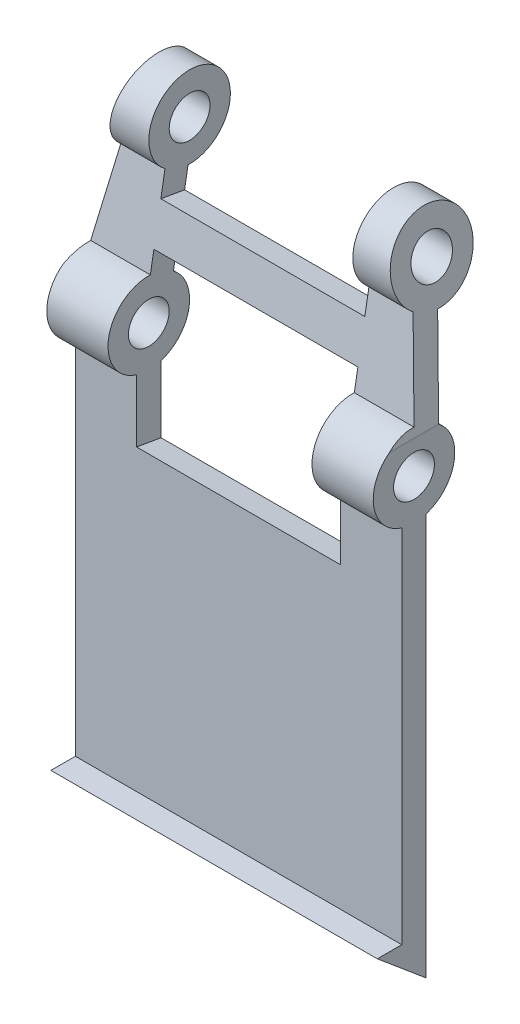
ISO-10303-21;
HEADER;
FILE_DESCRIPTION(('STEP AP214'),'2;1');
FILE_NAME('part.step','',(''),(''),'','','');
FILE_SCHEMA(('AUTOMOTIVE_DESIGN { 1 0 10303 214 1 1 1 1 }'));
ENDSEC;
DATA;
#1=APPLICATION_CONTEXT('core data for automotive mechanical design processes');
#2=APPLICATION_PROTOCOL_DEFINITION('international standard','automotive_design',2000,#1);
#3=PRODUCT_CONTEXT('',#1,'mechanical');
#4=PRODUCT('Part','Part','',(#3));
#5=PRODUCT_RELATED_PRODUCT_CATEGORY('part','',(#4));
#6=PRODUCT_DEFINITION_FORMATION('','',#4);
#7=PRODUCT_DEFINITION_CONTEXT('part definition',#1,'design');
#8=PRODUCT_DEFINITION('design','',#6,#7);
#9=PRODUCT_DEFINITION_SHAPE('','',#8);
#10=(LENGTH_UNIT() NAMED_UNIT(*) SI_UNIT(.MILLI.,.METRE.));
#11=(NAMED_UNIT(*) PLANE_ANGLE_UNIT() SI_UNIT($,.RADIAN.));
#12=(NAMED_UNIT(*) SI_UNIT($,.STERADIAN.) SOLID_ANGLE_UNIT());
#13=UNCERTAINTY_MEASURE_WITH_UNIT(LENGTH_MEASURE(1.E-05),#10,'distance_accuracy_value','');
#14=(GEOMETRIC_REPRESENTATION_CONTEXT(3) GLOBAL_UNCERTAINTY_ASSIGNED_CONTEXT((#13)) GLOBAL_UNIT_ASSIGNED_CONTEXT((#10,
#11,#12)) REPRESENTATION_CONTEXT('',''));
#15=CARTESIAN_POINT('',(0.,0.,0.));
#16=DIRECTION('',(0.,0.,1.));
#17=DIRECTION('',(1.,0.,0.));
#18=AXIS2_PLACEMENT_3D('',#15,#16,#17);
#19=CARTESIAN_POINT('',(-20.,19.3649167310371,-5.));
#20=DIRECTION('',(1.,0.,0.));
#21=DIRECTION('',(0.,0.,-1.));
#22=AXIS2_PLACEMENT_3D('',#19,#20,#21);
#23=CYLINDRICAL_SURFACE('',#22,5.);
#24=CARTESIAN_POINT('',(17.1701886456949,19.3649167310371,-5.));
#25=DIRECTION('',(-0.983483452738319,-0.180998061287722,0.));
#26=DIRECTION('',(0.180998061287722,-0.983483452738319,0.));
#27=AXIS2_PLACEMENT_3D('',#24,#25,#26);
#28=ELLIPSE('',#27,5.08396962458135,5.);
#29=CARTESIAN_POINT('',(17.9042525915353,15.3762566379427,-1.98493936018594));
#30=VERTEX_POINT('',#29);
#31=CARTESIAN_POINT('',(18.0897169639658,14.3685047313189,-4.81061380971055));
#32=VERTEX_POINT('',#31);
#33=EDGE_CURVE('E402',#30,#32,#28,.T.);
#34=ORIENTED_EDGE('',*,*,#33,.T.);
#35=DIRECTION('',(1.,0.,0.));
#36=VECTOR('',#35,1.);
#37=CARTESIAN_POINT('',(-20.,14.3685047313189,-4.81061380971055));
#38=LINE('',#37,#36);
#39=CARTESIAN_POINT('',(12.5,14.3685047313189,-4.81061380971055));
#40=VERTEX_POINT('',#39);
#41=EDGE_CURVE('E240',#40,#32,#38,.T.);
#42=ORIENTED_EDGE('',*,*,#41,.F.);
#43=CARTESIAN_POINT('',(12.5,19.3649167310371,-5.));
#44=DIRECTION('',(1.,0.,0.));
#45=DIRECTION('',(0.,1.,0.));
#46=AXIS2_PLACEMENT_3D('',#43,#44,#45);
#47=CIRCLE('',#46,5.);
#48=CARTESIAN_POINT('',(12.5,15.3762566379427,-1.98493936018594));
#49=VERTEX_POINT('',#48);
#50=EDGE_CURVE('E314',#40,#49,#47,.T.);
#51=ORIENTED_EDGE('',*,*,#50,.T.);
#52=DIRECTION('',(1.,0.,0.));
#53=VECTOR('',#52,1.);
#54=CARTESIAN_POINT('',(-20.,15.3762566379427,-1.98493936018594));
#55=LINE('',#54,#53);
#56=EDGE_CURVE('E243',#49,#30,#55,.T.);
#57=ORIENTED_EDGE('',*,*,#56,.T.);
#58=EDGE_LOOP('',(#34,#42,#51,#57));
#59=FACE_BOUND('',#58,.T.);
#60=ADVANCED_FACE('F33',(#59),#23,.T.);
#61=CARTESIAN_POINT('',(-20.,19.3649167310371,-5.));
#62=DIRECTION('',(1.,0.,0.));
#63=DIRECTION('',(0.,0.,-1.));
#64=AXIS2_PLACEMENT_3D('',#61,#62,#63);
#65=CYLINDRICAL_SURFACE('',#64,2.5);
#66=CARTESIAN_POINT('',(17.1701886456949,19.3649167310371,-5.));
#67=DIRECTION('',(-0.983483452738319,-0.180998061287722,0.));
#68=DIRECTION('',(0.180998061287722,-0.983483452738319,0.));
#69=AXIS2_PLACEMENT_3D('',#66,#67,#68);
#70=ELLIPSE('',#69,2.54198481229067,2.5);
#71=CARTESIAN_POINT('',(17.6302829685423,16.8649167310371,-5.));
#72=VERTEX_POINT('',#71);
#73=EDGE_CURVE('E303',#72,#72,#70,.T.);
#74=ORIENTED_EDGE('',*,*,#73,.F.);
#75=EDGE_LOOP('',(#74));
#76=FACE_BOUND('',#75,.T.);
#77=CARTESIAN_POINT('',(12.5,19.3649167310371,-5.));
#78=DIRECTION('',(1.,0.,0.));
#79=DIRECTION('',(0.,1.,0.));
#80=AXIS2_PLACEMENT_3D('',#77,#78,#79);
#81=CIRCLE('',#80,2.5);
#82=CARTESIAN_POINT('',(12.5,21.8649167310371,-5.));
#83=VERTEX_POINT('',#82);
#84=EDGE_CURVE('E281',#83,#83,#81,.T.);
#85=ORIENTED_EDGE('',*,*,#84,.F.);
#86=EDGE_LOOP('',(#85));
#87=FACE_BOUND('',#86,.T.);
#88=ADVANCED_FACE('F417',(#76,#87),#65,.F.);
#89=CARTESIAN_POINT('',(-20.,0.,0.));
#90=DIRECTION('',(1.,0.,0.));
#91=DIRECTION('',(0.,0.,-1.));
#92=AXIS2_PLACEMENT_3D('',#89,#90,#91);
#93=CYLINDRICAL_SURFACE('',#92,5.);
#94=CARTESIAN_POINT('',(20.,0.,0.));
#95=DIRECTION('',(-1.,0.,0.));
#96=DIRECTION('',(0.,0.,1.));
#97=AXIS2_PLACEMENT_3D('',#94,#95,#96);
#98=CIRCLE('',#97,5.);
#99=CARTESIAN_POINT('',(20.,-4.76969600708473,1.49999999999999));
#100=VERTEX_POINT('',#99);
#101=CARTESIAN_POINT('',(20.,3.98866009309443,3.01506063981406));
#102=VERTEX_POINT('',#101);
#103=EDGE_CURVE('E226',#100,#102,#98,.T.);
#104=ORIENTED_EDGE('',*,*,#103,.T.);
#105=CARTESIAN_POINT('',(20.7340639458404,0.,0.));
#106=DIRECTION('',(-0.983483452738319,-0.180998061287722,0.));
#107=DIRECTION('',(0.180998061287722,-0.983483452738319,0.));
#108=AXIS2_PLACEMENT_3D('',#105,#106,#107);
#109=ELLIPSE('',#108,5.08396962458135,5.);
#110=CARTESIAN_POINT('',(19.8145356275695,4.99641199971816,-0.189386190289448));
#111=VERTEX_POINT('',#110);
#112=EDGE_CURVE('E406',#102,#111,#109,.T.);
#113=ORIENTED_EDGE('',*,*,#112,.T.);
#114=DIRECTION('',(1.,0.,0.));
#115=VECTOR('',#114,1.);
#116=CARTESIAN_POINT('',(-20.,4.99641199971816,-0.189386190289448));
#117=LINE('',#116,#115);
#118=CARTESIAN_POINT('',(12.5,4.99641199971816,-0.189386190289448));
#119=VERTEX_POINT('',#118);
#120=EDGE_CURVE('E246',#119,#111,#117,.T.);
#121=ORIENTED_EDGE('',*,*,#120,.F.);
#122=CARTESIAN_POINT('',(12.5,0.,0.));
#123=DIRECTION('',(1.,0.,0.));
#124=DIRECTION('',(0.,0.,-1.));
#125=AXIS2_PLACEMENT_3D('',#122,#123,#124);
#126=CIRCLE('',#125,5.);
#127=CARTESIAN_POINT('',(12.5,-4.76969600708473,1.49999999999999));
#128=VERTEX_POINT('',#127);
#129=EDGE_CURVE('E359',#119,#128,#126,.T.);
#130=ORIENTED_EDGE('',*,*,#129,.T.);
#131=DIRECTION('',(1.,0.,0.));
#132=VECTOR('',#131,1.);
#133=CARTESIAN_POINT('',(-20.,-4.76969600708473,1.49999999999999));
#134=LINE('',#133,#132);
#135=EDGE_CURVE('E248',#128,#100,#134,.T.);
#136=ORIENTED_EDGE('',*,*,#135,.T.);
#137=EDGE_LOOP('',(#104,#113,#121,#130,#136));
#138=FACE_BOUND('',#137,.T.);
#139=ADVANCED_FACE('F420',(#138),#93,.T.);
#140=CARTESIAN_POINT('',(-20.,0.,0.));
#141=DIRECTION('',(1.,0.,0.));
#142=DIRECTION('',(0.,0.,-1.));
#143=AXIS2_PLACEMENT_3D('',#140,#141,#142);
#144=CYLINDRICAL_SURFACE('',#143,5.);
#145=DIRECTION('',(1.,0.,0.));
#146=VECTOR('',#145,1.);
#147=CARTESIAN_POINT('',(-20.,-4.76969600708473,-1.5));
#148=LINE('',#147,#146);
#149=CARTESIAN_POINT('',(12.5,-4.76969600708473,-1.5));
#150=VERTEX_POINT('',#149);
#151=CARTESIAN_POINT('',(20.,-4.76969600708473,-1.5));
#152=VERTEX_POINT('',#151);
#153=EDGE_CURVE('E209',#150,#152,#148,.T.);
#154=ORIENTED_EDGE('',*,*,#153,.F.);
#155=CARTESIAN_POINT('',(12.5,0.,0.));
#156=DIRECTION('',(1.,0.,0.));
#157=DIRECTION('',(0.,0.,-1.));
#158=AXIS2_PLACEMENT_3D('',#155,#156,#157);
#159=CIRCLE('',#158,5.);
#160=CARTESIAN_POINT('',(12.5,3.98866009309443,-3.01506063981406));
#161=VERTEX_POINT('',#160);
#162=EDGE_CURVE('E269',#150,#161,#159,.T.);
#163=ORIENTED_EDGE('',*,*,#162,.T.);
#164=DIRECTION('',(1.,0.,0.));
#165=VECTOR('',#164,1.);
#166=CARTESIAN_POINT('',(-20.,3.98866009309443,-3.01506063981406));
#167=LINE('',#166,#165);
#168=CARTESIAN_POINT('',(20.,3.98866009309443,-3.01506063981406));
#169=VERTEX_POINT('',#168);
#170=EDGE_CURVE('E236',#161,#169,#167,.T.);
#171=ORIENTED_EDGE('',*,*,#170,.T.);
#172=CARTESIAN_POINT('',(20.,0.,0.));
#173=DIRECTION('',(-1.,0.,0.));
#174=DIRECTION('',(0.,0.,1.));
#175=AXIS2_PLACEMENT_3D('',#172,#173,#174);
#176=CIRCLE('',#175,5.);
#177=EDGE_CURVE('E229',#169,#152,#176,.T.);
#178=ORIENTED_EDGE('',*,*,#177,.T.);
#179=EDGE_LOOP('',(#154,#163,#171,#178));
#180=FACE_BOUND('',#179,.T.);
#181=ADVANCED_FACE('F439',(#180),#144,.T.);
#182=CARTESIAN_POINT('',(-20.,0.,0.));
#183=DIRECTION('',(1.,0.,0.));
#184=DIRECTION('',(0.,0.,-1.));
#185=AXIS2_PLACEMENT_3D('',#182,#183,#184);
#186=CYLINDRICAL_SURFACE('',#185,2.5);
#187=CARTESIAN_POINT('',(12.5,0.,0.));
#188=DIRECTION('',(1.,0.,0.));
#189=DIRECTION('',(0.,0.,-1.));
#190=AXIS2_PLACEMENT_3D('',#187,#188,#189);
#191=CIRCLE('',#190,2.5);
#192=CARTESIAN_POINT('',(12.5,0.,-2.5));
#193=VERTEX_POINT('',#192);
#194=EDGE_CURVE('E266',#193,#193,#191,.T.);
#195=ORIENTED_EDGE('',*,*,#194,.F.);
#196=EDGE_LOOP('',(#195));
#197=FACE_BOUND('',#196,.T.);
#198=CARTESIAN_POINT('',(20.,0.,0.));
#199=DIRECTION('',(-1.,0.,0.));
#200=DIRECTION('',(0.,0.,1.));
#201=AXIS2_PLACEMENT_3D('',#198,#199,#200);
#202=CIRCLE('',#201,2.5);
#203=CARTESIAN_POINT('',(20.,0.,2.5));
#204=VERTEX_POINT('',#203);
#205=EDGE_CURVE('E371',#204,#204,#202,.T.);
#206=ORIENTED_EDGE('',*,*,#205,.F.);
#207=EDGE_LOOP('',(#206));
#208=FACE_BOUND('',#207,.T.);
#209=ADVANCED_FACE('F458',(#197,#208),#186,.F.);
#210=CARTESIAN_POINT('',(-20.,0.,0.));
#211=DIRECTION('',(-1.,0.,0.));
#212=DIRECTION('',(0.,0.,1.));
#213=AXIS2_PLACEMENT_3D('',#210,#211,#212);
#214=PLANE('',#213);
#215=DIRECTION('',(0.,0.,-1.));
#216=VECTOR('',#215,1.);
#217=CARTESIAN_POINT('',(-20.,3.98866009309443,5.));
#218=LINE('',#217,#216);
#219=CARTESIAN_POINT('',(-20.,3.98866009309443,3.01506063981406));
#220=VERTEX_POINT('',#219);
#221=CARTESIAN_POINT('',(-20.,3.98866009309443,-3.01506063981406));
#222=VERTEX_POINT('',#221);
#223=EDGE_CURVE('E181',#220,#222,#218,.T.);
#224=ORIENTED_EDGE('',*,*,#223,.T.);
#225=CARTESIAN_POINT('',(-20.,0.,0.));
#226=DIRECTION('',(-1.,0.,0.));
#227=DIRECTION('',(0.,0.,1.));
#228=AXIS2_PLACEMENT_3D('',#225,#226,#227);
#229=CIRCLE('',#228,5.);
#230=CARTESIAN_POINT('',(-20.,-4.76969600708473,-1.5));
#231=VERTEX_POINT('',#230);
#232=EDGE_CURVE('E207',#222,#231,#229,.T.);
#233=ORIENTED_EDGE('',*,*,#232,.T.);
#234=DIRECTION('',(0.,-1.,0.));
#235=VECTOR('',#234,1.);
#236=CARTESIAN_POINT('',(-20.,-4.76969600708473,-1.5));
#237=LINE('',#236,#235);
#238=CARTESIAN_POINT('',(-20.,-54.0345977870637,-1.5));
#239=VERTEX_POINT('',#238);
#240=EDGE_CURVE('E232',#231,#239,#237,.T.);
#241=ORIENTED_EDGE('',*,*,#240,.T.);
#242=DIRECTION('',(0.,0.642787609686538,0.76604444311898));
#243=VECTOR('',#242,1.);
#244=CARTESIAN_POINT('',(-20.,-54.0345977870637,-1.5));
#245=LINE('',#244,#243);
#246=CARTESIAN_POINT('',(-20.,-49.,4.49999999999999));
#247=VERTEX_POINT('',#246);
#248=EDGE_CURVE('E378',#239,#247,#245,.T.);
#249=ORIENTED_EDGE('',*,*,#248,.T.);
#250=DIRECTION('',(0.,0.,-1.));
#251=VECTOR('',#250,1.);
#252=CARTESIAN_POINT('',(-20.,-49.,4.49999999999999));
#253=LINE('',#252,#251);
#254=CARTESIAN_POINT('',(-20.,-49.,1.49999999999999));
#255=VERTEX_POINT('',#254);
#256=EDGE_CURVE('E211',#247,#255,#253,.T.);
#257=ORIENTED_EDGE('',*,*,#256,.T.);
#258=DIRECTION('',(0.,1.,0.));
#259=VECTOR('',#258,1.);
#260=CARTESIAN_POINT('',(-20.,-49.,1.49999999999999));
#261=LINE('',#260,#259);
#262=CARTESIAN_POINT('',(-20.,-4.76969600708473,1.49999999999999));
#263=VERTEX_POINT('',#262);
#264=EDGE_CURVE('E205',#255,#263,#261,.T.);
#265=ORIENTED_EDGE('',*,*,#264,.T.);
#266=CARTESIAN_POINT('',(-20.,0.,0.));
#267=DIRECTION('',(-1.,0.,0.));
#268=DIRECTION('',(0.,0.,1.));
#269=AXIS2_PLACEMENT_3D('',#266,#267,#268);
#270=CIRCLE('',#269,5.);
#271=EDGE_CURVE('E196',#263,#220,#270,.T.);
#272=ORIENTED_EDGE('',*,*,#271,.T.);
#273=EDGE_LOOP('',(#224,#233,#241,#249,#257,#265,#272));
#274=FACE_BOUND('',#273,.T.);
#275=CARTESIAN_POINT('',(-20.,0.,0.));
#276=DIRECTION('',(-1.,0.,0.));
#277=DIRECTION('',(0.,0.,1.));
#278=AXIS2_PLACEMENT_3D('',#275,#276,#277);
#279=CIRCLE('',#278,2.5);
#280=CARTESIAN_POINT('',(-20.,0.,2.5));
#281=VERTEX_POINT('',#280);
#282=EDGE_CURVE('E219',#281,#281,#279,.T.);
#283=ORIENTED_EDGE('',*,*,#282,.F.);
#284=EDGE_LOOP('',(#283));
#285=FACE_BOUND('',#284,.T.);
#286=ADVANCED_FACE('F202',(#274,#285),#214,.T.);
#287=CARTESIAN_POINT('',(20.,0.,0.));
#288=DIRECTION('',(-1.,0.,0.));
#289=DIRECTION('',(0.,0.,1.));
#290=AXIS2_PLACEMENT_3D('',#287,#288,#289);
#291=PLANE('',#290);
#292=ORIENTED_EDGE('',*,*,#177,.F.);
#293=DIRECTION('',(0.,0.,-1.));
#294=VECTOR('',#293,1.);
#295=CARTESIAN_POINT('',(20.,3.98866009309443,5.));
#296=LINE('',#295,#294);
#297=EDGE_CURVE('E199',#102,#169,#296,.T.);
#298=ORIENTED_EDGE('',*,*,#297,.F.);
#299=ORIENTED_EDGE('',*,*,#103,.F.);
#300=DIRECTION('',(0.,1.,0.));
#301=VECTOR('',#300,1.);
#302=CARTESIAN_POINT('',(20.,-49.,1.49999999999999));
#303=LINE('',#302,#301);
#304=CARTESIAN_POINT('',(20.,-49.,1.49999999999999));
#305=VERTEX_POINT('',#304);
#306=EDGE_CURVE('E223',#305,#100,#303,.T.);
#307=ORIENTED_EDGE('',*,*,#306,.F.);
#308=DIRECTION('',(0.,0.,-1.));
#309=VECTOR('',#308,1.);
#310=CARTESIAN_POINT('',(20.,-49.,4.49999999999999));
#311=LINE('',#310,#309);
#312=CARTESIAN_POINT('',(20.,-49.,4.49999999999999));
#313=VERTEX_POINT('',#312);
#314=EDGE_CURVE('E221',#313,#305,#311,.T.);
#315=ORIENTED_EDGE('',*,*,#314,.F.);
#316=DIRECTION('',(0.,0.642787609686538,0.76604444311898));
#317=VECTOR('',#316,1.);
#318=CARTESIAN_POINT('',(20.,-54.0345977870637,-1.5));
#319=LINE('',#318,#317);
#320=CARTESIAN_POINT('',(20.,-54.0345977870637,-1.5));
#321=VERTEX_POINT('',#320);
#322=EDGE_CURVE('E218',#321,#313,#319,.T.);
#323=ORIENTED_EDGE('',*,*,#322,.F.);
#324=DIRECTION('',(0.,-1.,0.));
#325=VECTOR('',#324,1.);
#326=CARTESIAN_POINT('',(20.,-4.76969600708473,-1.5));
#327=LINE('',#326,#325);
#328=EDGE_CURVE('E215',#152,#321,#327,.T.);
#329=ORIENTED_EDGE('',*,*,#328,.F.);
#330=EDGE_LOOP('',(#292,#298,#299,#307,#315,#323,#329));
#331=FACE_BOUND('',#330,.T.);
#332=ORIENTED_EDGE('',*,*,#205,.T.);
#333=EDGE_LOOP('',(#332));
#334=FACE_BOUND('',#333,.T.);
#335=ADVANCED_FACE('F442',(#331,#334),#291,.F.);
#336=CARTESIAN_POINT('',(-20.,-4.76969600708473,-1.5));
#337=DIRECTION('',(0.,0.,1.));
#338=DIRECTION('',(0.,-1.,0.));
#339=AXIS2_PLACEMENT_3D('',#336,#337,#338);
#340=PLANE('',#339);
#341=DIRECTION('',(1.,0.,0.));
#342=VECTOR('',#341,1.);
#343=CARTESIAN_POINT('',(-20.,-12.9451212593262,-1.5));
#344=LINE('',#343,#342);
#345=CARTESIAN_POINT('',(-12.5,-12.9451212593262,-1.5));
#346=VERTEX_POINT('',#345);
#347=CARTESIAN_POINT('',(12.5,-12.9451212593262,-1.5));
#348=VERTEX_POINT('',#347);
#349=EDGE_CURVE('E368',#346,#348,#344,.T.);
#350=ORIENTED_EDGE('',*,*,#349,.T.);
#351=DIRECTION('',(0.,1.,0.));
#352=VECTOR('',#351,1.);
#353=CARTESIAN_POINT('',(12.5,-4.76969600708473,-1.5));
#354=LINE('',#353,#352);
#355=EDGE_CURVE('E353',#348,#150,#354,.T.);
#356=ORIENTED_EDGE('',*,*,#355,.T.);
#357=ORIENTED_EDGE('',*,*,#153,.T.);
#358=ORIENTED_EDGE('',*,*,#328,.T.);
#359=DIRECTION('',(1.,0.,0.));
#360=VECTOR('',#359,1.);
#361=CARTESIAN_POINT('',(-20.,-54.0345977870637,-1.5));
#362=LINE('',#361,#360);
#363=EDGE_CURVE('E257',#239,#321,#362,.T.);
#364=ORIENTED_EDGE('',*,*,#363,.F.);
#365=ORIENTED_EDGE('',*,*,#240,.F.);
#366=CARTESIAN_POINT('',(-12.5,-4.76969600708473,-1.5));
#367=VERTEX_POINT('',#366);
#368=EDGE_CURVE('E233',#231,#367,#148,.T.);
#369=ORIENTED_EDGE('',*,*,#368,.T.);
#370=DIRECTION('',(0.,-1.,0.));
#371=VECTOR('',#370,1.);
#372=CARTESIAN_POINT('',(-12.5,-4.76969600708473,-1.5));
#373=LINE('',#372,#371);
#374=EDGE_CURVE('E338',#367,#346,#373,.T.);
#375=ORIENTED_EDGE('',*,*,#374,.T.);
#376=EDGE_LOOP('',(#350,#356,#357,#358,#364,#365,#369,#375));
#377=FACE_BOUND('',#376,.T.);
#378=ADVANCED_FACE('F35',(#377),#340,.F.);
#379=CARTESIAN_POINT('',(-20.,-54.0345977870637,-1.5));
#380=DIRECTION('',(0.,0.76604444311898,-0.642787609686538));
#381=DIRECTION('',(0.,0.642787609686538,0.76604444311898));
#382=AXIS2_PLACEMENT_3D('',#379,#380,#381);
#383=PLANE('',#382);
#384=ORIENTED_EDGE('',*,*,#322,.T.);
#385=DIRECTION('',(1.,0.,0.));
#386=VECTOR('',#385,1.);
#387=CARTESIAN_POINT('',(-20.,-49.,4.49999999999999));
#388=LINE('',#387,#386);
#389=EDGE_CURVE('E254',#247,#313,#388,.T.);
#390=ORIENTED_EDGE('',*,*,#389,.F.);
#391=ORIENTED_EDGE('',*,*,#248,.F.);
#392=ORIENTED_EDGE('',*,*,#363,.T.);
#393=EDGE_LOOP('',(#384,#390,#391,#392));
#394=FACE_BOUND('',#393,.T.);
#395=ADVANCED_FACE('F643',(#394),#383,.F.);
#396=CARTESIAN_POINT('',(-20.,-49.,4.49999999999999));
#397=DIRECTION('',(0.,-1.,0.));
#398=DIRECTION('',(0.,0.,-1.));
#399=AXIS2_PLACEMENT_3D('',#396,#397,#398);
#400=PLANE('',#399);
#401=ORIENTED_EDGE('',*,*,#314,.T.);
#402=DIRECTION('',(1.,0.,0.));
#403=VECTOR('',#402,1.);
#404=CARTESIAN_POINT('',(-20.,-49.,1.49999999999999));
#405=LINE('',#404,#403);
#406=EDGE_CURVE('E251',#255,#305,#405,.T.);
#407=ORIENTED_EDGE('',*,*,#406,.F.);
#408=ORIENTED_EDGE('',*,*,#256,.F.);
#409=ORIENTED_EDGE('',*,*,#389,.T.);
#410=EDGE_LOOP('',(#401,#407,#408,#409));
#411=FACE_BOUND('',#410,.T.);
#412=ADVANCED_FACE('F383',(#411),#400,.F.);
#413=CARTESIAN_POINT('',(-20.,-49.,1.49999999999999));
#414=DIRECTION('',(0.,0.,-1.));
#415=DIRECTION('',(-1.,0.,0.));
#416=AXIS2_PLACEMENT_3D('',#413,#414,#415);
#417=PLANE('',#416);
#418=ORIENTED_EDGE('',*,*,#135,.F.);
#419=DIRECTION('',(0.,-1.,0.));
#420=VECTOR('',#419,1.);
#421=CARTESIAN_POINT('',(12.5,-49.,1.49999999999999));
#422=LINE('',#421,#420);
#423=CARTESIAN_POINT('',(12.5,-12.4261674890691,1.49999999999999));
#424=VERTEX_POINT('',#423);
#425=EDGE_CURVE('E362',#128,#424,#422,.T.);
#426=ORIENTED_EDGE('',*,*,#425,.T.);
#427=DIRECTION('',(-1.,0.,0.));
#428=VECTOR('',#427,1.);
#429=CARTESIAN_POINT('',(-20.,-12.4261674890691,1.49999999999999));
#430=LINE('',#429,#428);
#431=CARTESIAN_POINT('',(-12.5,-12.4261674890691,1.49999999999999));
#432=VERTEX_POINT('',#431);
#433=EDGE_CURVE('E273',#424,#432,#430,.T.);
#434=ORIENTED_EDGE('',*,*,#433,.T.);
#435=DIRECTION('',(0.,1.,0.));
#436=VECTOR('',#435,1.);
#437=CARTESIAN_POINT('',(-12.5,-49.,1.49999999999999));
#438=LINE('',#437,#436);
#439=CARTESIAN_POINT('',(-12.5,-4.76969600708473,1.49999999999999));
#440=VERTEX_POINT('',#439);
#441=EDGE_CURVE('E270',#432,#440,#438,.T.);
#442=ORIENTED_EDGE('',*,*,#441,.T.);
#443=EDGE_CURVE('E249',#263,#440,#134,.T.);
#444=ORIENTED_EDGE('',*,*,#443,.F.);
#445=ORIENTED_EDGE('',*,*,#264,.F.);
#446=ORIENTED_EDGE('',*,*,#406,.T.);
#447=ORIENTED_EDGE('',*,*,#306,.T.);
#448=EDGE_LOOP('',(#418,#426,#434,#442,#444,#445,#446,#447));
#449=FACE_BOUND('',#448,.T.);
#450=ADVANCED_FACE('F388',(#449),#417,.F.);
#451=CARTESIAN_POINT('',(-19.8145356275695,4.99641199971816,-0.189386190289448));
#452=VERTEX_POINT('',#451);
#453=CARTESIAN_POINT('',(-12.5,4.99641199971816,-0.189386190289448));
#454=VERTEX_POINT('',#453);
#455=EDGE_CURVE('E198',#452,#454,#117,.T.);
#456=ORIENTED_EDGE('',*,*,#455,.F.);
#457=CARTESIAN_POINT('',(-20.7340639458404,0.,0.));
#458=DIRECTION('',(0.983483452738319,-0.180998061287722,0.));
#459=DIRECTION('',(0.180998061287722,0.983483452738319,0.));
#460=AXIS2_PLACEMENT_3D('',#457,#458,#459);
#461=ELLIPSE('',#460,5.08396962458135,5.);
#462=EDGE_CURVE('E184',#452,#220,#461,.T.);
#463=ORIENTED_EDGE('',*,*,#462,.T.);
#464=ORIENTED_EDGE('',*,*,#271,.F.);
#465=ORIENTED_EDGE('',*,*,#443,.T.);
#466=CARTESIAN_POINT('',(-12.5,0.,0.));
#467=DIRECTION('',(-1.,0.,0.));
#468=DIRECTION('',(0.,0.,1.));
#469=AXIS2_PLACEMENT_3D('',#466,#467,#468);
#470=CIRCLE('',#469,5.);
#471=EDGE_CURVE('E344',#440,#454,#470,.T.);
#472=ORIENTED_EDGE('',*,*,#471,.T.);
#473=EDGE_LOOP('',(#456,#463,#464,#465,#472));
#474=FACE_BOUND('',#473,.T.);
#475=ADVANCED_FACE('F194',(#474),#93,.T.);
#476=CARTESIAN_POINT('',(-20.,4.99641199971816,-0.189386190289448));
#477=DIRECTION('',(0.,-0.170453097397978,-0.985365790753584));
#478=DIRECTION('',(0.,0.985365790753584,-0.170453097397978));
#479=AXIS2_PLACEMENT_3D('',#476,#477,#478);
#480=PLANE('',#479);
#481=CARTESIAN_POINT('',(-17.9042525915353,15.3762566379427,-1.98493936018594));
#482=VERTEX_POINT('',#481);
#483=CARTESIAN_POINT('',(-12.5,15.3762566379427,-1.98493936018594));
#484=VERTEX_POINT('',#483);
#485=EDGE_CURVE('E244',#482,#484,#55,.T.);
#486=ORIENTED_EDGE('',*,*,#485,.F.);
#487=DIRECTION('',(-0.178434237190568,-0.969552482664144,0.167717638780227));
#488=VECTOR('',#487,1.);
#489=CARTESIAN_POINT('',(-19.8204405863651,4.96432641149005,-0.183835877962149));
#490=LINE('',#489,#488);
#491=EDGE_CURVE('E200',#482,#452,#490,.T.);
#492=ORIENTED_EDGE('',*,*,#491,.T.);
#493=ORIENTED_EDGE('',*,*,#455,.T.);
#494=DIRECTION('',(0.,0.985365790753584,-0.170453097397978));
#495=VECTOR('',#494,1.);
#496=CARTESIAN_POINT('',(-12.5,4.99641199971816,-0.189386190289448));
#497=LINE('',#496,#495);
#498=CARTESIAN_POINT('',(-12.5,7.5036014269686,-0.62309132562956));
#499=VERTEX_POINT('',#498);
#500=EDGE_CURVE('E341',#454,#499,#497,.T.);
#501=ORIENTED_EDGE('',*,*,#500,.T.);
#502=DIRECTION('',(1.,0.,0.));
#503=VECTOR('',#502,1.);
#504=CARTESIAN_POINT('',(-20.,7.5036014269686,-0.623091325629559));
#505=LINE('',#504,#503);
#506=CARTESIAN_POINT('',(12.5,7.5036014269686,-0.623091325629561));
#507=VERTEX_POINT('',#506);
#508=EDGE_CURVE('E365',#499,#507,#505,.T.);
#509=ORIENTED_EDGE('',*,*,#508,.T.);
#510=DIRECTION('',(0.,-0.985365790753584,0.170453097397978));
#511=VECTOR('',#510,1.);
#512=CARTESIAN_POINT('',(12.5,4.99641199971816,-0.189386190289448));
#513=LINE('',#512,#511);
#514=EDGE_CURVE('E356',#507,#119,#513,.T.);
#515=ORIENTED_EDGE('',*,*,#514,.T.);
#516=ORIENTED_EDGE('',*,*,#120,.T.);
#517=DIRECTION('',(-0.178434237190568,0.969552482664144,-0.167717638780227));
#518=VECTOR('',#517,1.);
#519=CARTESIAN_POINT('',(18.5468895062939,11.884380717906,-1.38089863552827));
#520=LINE('',#519,#518);
#521=EDGE_CURVE('E404',#111,#30,#520,.T.);
#522=ORIENTED_EDGE('',*,*,#521,.T.);
#523=ORIENTED_EDGE('',*,*,#56,.F.);
#524=DIRECTION('',(0.,-0.985365790753584,0.170453097397978));
#525=VECTOR('',#524,1.);
#526=CARTESIAN_POINT('',(12.5,4.99641199971816,-0.189386190289447));
#527=LINE('',#526,#525);
#528=CARTESIAN_POINT('',(12.5,12.4304303807365,-1.47535681261945));
#529=VERTEX_POINT('',#528);
#530=EDGE_CURVE('E317',#49,#529,#527,.T.);
#531=ORIENTED_EDGE('',*,*,#530,.T.);
#532=DIRECTION('',(-1.,0.,0.));
#533=VECTOR('',#532,1.);
#534=CARTESIAN_POINT('',(-20.,12.4304303807365,-1.47535681261945));
#535=LINE('',#534,#533);
#536=CARTESIAN_POINT('',(-12.5,12.4304303807365,-1.47535681261945));
#537=VERTEX_POINT('',#536);
#538=EDGE_CURVE('E320',#529,#537,#535,.T.);
#539=ORIENTED_EDGE('',*,*,#538,.T.);
#540=DIRECTION('',(0.,0.985365790753584,-0.170453097397978));
#541=VECTOR('',#540,1.);
#542=CARTESIAN_POINT('',(-12.5,4.99641199971816,-0.189386190289448));
#543=LINE('',#542,#541);
#544=EDGE_CURVE('E285',#537,#484,#543,.T.);
#545=ORIENTED_EDGE('',*,*,#544,.T.);
#546=EDGE_LOOP('',(#486,#492,#493,#501,#509,#515,#516,#522,#523,#531,#539,#545));
#547=FACE_BOUND('',#546,.T.);
#548=ADVANCED_FACE('F396',(#547),#480,.F.);
#549=CARTESIAN_POINT('',(-18.0897169639658,14.3685047313189,-4.81061380971055));
#550=VERTEX_POINT('',#549);
#551=CARTESIAN_POINT('',(-12.5,14.3685047313189,-4.81061380971055));
#552=VERTEX_POINT('',#551);
#553=EDGE_CURVE('E241',#550,#552,#38,.T.);
#554=ORIENTED_EDGE('',*,*,#553,.F.);
#555=CARTESIAN_POINT('',(-17.1701886456949,19.3649167310371,-5.));
#556=DIRECTION('',(0.983483452738319,-0.180998061287722,0.));
#557=DIRECTION('',(0.180998061287722,0.983483452738319,0.));
#558=AXIS2_PLACEMENT_3D('',#555,#556,#557);
#559=ELLIPSE('',#558,5.08396962458135,5.);
#560=EDGE_CURVE('E49',#550,#482,#559,.T.);
#561=ORIENTED_EDGE('',*,*,#560,.T.);
#562=ORIENTED_EDGE('',*,*,#485,.T.);
#563=CARTESIAN_POINT('',(-12.5,19.3649167310371,-5.));
#564=DIRECTION('',(-1.,0.,0.));
#565=DIRECTION('',(0.,-1.,0.));
#566=AXIS2_PLACEMENT_3D('',#563,#564,#565);
#567=CIRCLE('',#566,5.);
#568=EDGE_CURVE('E309',#484,#552,#567,.T.);
#569=ORIENTED_EDGE('',*,*,#568,.T.);
#570=EDGE_LOOP('',(#554,#561,#562,#569));
#571=FACE_BOUND('',#570,.T.);
#572=ADVANCED_FACE('F466',(#571),#23,.T.);
#573=CARTESIAN_POINT('',(-20.,3.98866009309443,-3.01506063981406));
#574=DIRECTION('',(0.,0.170453097397978,0.985365790753584));
#575=DIRECTION('',(0.,-0.985365790753584,0.170453097397978));
#576=AXIS2_PLACEMENT_3D('',#573,#574,#575);
#577=PLANE('',#576);
#578=CARTESIAN_POINT('',(-12.5,3.98866009309443,-3.01506063981406));
#579=VERTEX_POINT('',#578);
#580=EDGE_CURVE('E237',#222,#579,#167,.T.);
#581=ORIENTED_EDGE('',*,*,#580,.F.);
#582=DIRECTION('',(0.178434237190568,0.969552482664144,-0.167717638780227));
#583=VECTOR('',#582,1.);
#584=CARTESIAN_POINT('',(-20.,3.98866009309443,-3.01506063981406));
#585=LINE('',#584,#583);
#586=EDGE_CURVE('E186',#222,#550,#585,.T.);
#587=ORIENTED_EDGE('',*,*,#586,.T.);
#588=ORIENTED_EDGE('',*,*,#553,.T.);
#589=DIRECTION('',(0.,-0.985365790753584,0.170453097397978));
#590=VECTOR('',#589,1.);
#591=CARTESIAN_POINT('',(-12.5,3.98866009309443,-3.01506063981406));
#592=LINE('',#591,#590);
#593=CARTESIAN_POINT('',(-12.5,11.9265544274246,-4.38819403738176));
#594=VERTEX_POINT('',#593);
#595=EDGE_CURVE('E279',#552,#594,#592,.T.);
#596=ORIENTED_EDGE('',*,*,#595,.T.);
#597=DIRECTION('',(1.,0.,0.));
#598=VECTOR('',#597,1.);
#599=CARTESIAN_POINT('',(-20.,11.9265544274246,-4.38819403738176));
#600=LINE('',#599,#598);
#601=CARTESIAN_POINT('',(12.5,11.9265544274246,-4.38819403738176));
#602=VERTEX_POINT('',#601);
#603=EDGE_CURVE('E42',#594,#602,#600,.T.);
#604=ORIENTED_EDGE('',*,*,#603,.T.);
#605=DIRECTION('',(0.,0.985365790753584,-0.170453097397978));
#606=VECTOR('',#605,1.);
#607=CARTESIAN_POINT('',(12.5,3.98866009309442,-3.01506063981406));
#608=LINE('',#607,#606);
#609=EDGE_CURVE('E284',#602,#40,#608,.T.);
#610=ORIENTED_EDGE('',*,*,#609,.T.);
#611=ORIENTED_EDGE('',*,*,#41,.T.);
#612=DIRECTION('',(0.178434237190568,-0.969552482664144,0.167717638780227));
#613=VECTOR('',#612,1.);
#614=CARTESIAN_POINT('',(18.7264489199288,10.9087143995103,-4.21212339738018));
#615=LINE('',#614,#613);
#616=EDGE_CURVE('E11',#32,#169,#615,.T.);
#617=ORIENTED_EDGE('',*,*,#616,.T.);
#618=ORIENTED_EDGE('',*,*,#170,.F.);
#619=DIRECTION('',(0.,0.985365790753584,-0.170453097397978));
#620=VECTOR('',#619,1.);
#621=CARTESIAN_POINT('',(12.5,3.98866009309443,-3.01506063981406));
#622=LINE('',#621,#620);
#623=CARTESIAN_POINT('',(12.5,6.99972547365673,-3.53592855039187));
#624=VERTEX_POINT('',#623);
#625=EDGE_CURVE('E350',#161,#624,#622,.T.);
#626=ORIENTED_EDGE('',*,*,#625,.T.);
#627=DIRECTION('',(-1.,0.,0.));
#628=VECTOR('',#627,1.);
#629=CARTESIAN_POINT('',(-20.,6.99972547365673,-3.53592855039187));
#630=LINE('',#629,#628);
#631=CARTESIAN_POINT('',(-12.5,6.99972547365673,-3.53592855039187));
#632=VERTEX_POINT('',#631);
#633=EDGE_CURVE('E260',#624,#632,#630,.T.);
#634=ORIENTED_EDGE('',*,*,#633,.T.);
#635=DIRECTION('',(0.,-0.985365790753584,0.170453097397978));
#636=VECTOR('',#635,1.);
#637=CARTESIAN_POINT('',(-12.5,3.98866009309443,-3.01506063981406));
#638=LINE('',#637,#636);
#639=EDGE_CURVE('E335',#632,#579,#638,.T.);
#640=ORIENTED_EDGE('',*,*,#639,.T.);
#641=EDGE_LOOP('',(#581,#587,#588,#596,#604,#610,#611,#617,#618,#626,#634,#640));
#642=FACE_BOUND('',#641,.T.);
#643=ADVANCED_FACE('F290',(#642),#577,.F.);
#644=ORIENTED_EDGE('',*,*,#580,.T.);
#645=CARTESIAN_POINT('',(-12.5,0.,0.));
#646=DIRECTION('',(-1.,0.,0.));
#647=DIRECTION('',(0.,0.,1.));
#648=AXIS2_PLACEMENT_3D('',#645,#646,#647);
#649=CIRCLE('',#648,5.);
#650=EDGE_CURVE('E264',#579,#367,#649,.T.);
#651=ORIENTED_EDGE('',*,*,#650,.T.);
#652=ORIENTED_EDGE('',*,*,#368,.F.);
#653=ORIENTED_EDGE('',*,*,#232,.F.);
#654=EDGE_LOOP('',(#644,#651,#652,#653));
#655=FACE_BOUND('',#654,.T.);
#656=ADVANCED_FACE('F460',(#655),#144,.T.);
#657=CARTESIAN_POINT('',(-12.5,0.,0.));
#658=DIRECTION('',(-1.,0.,0.));
#659=DIRECTION('',(0.,0.,1.));
#660=AXIS2_PLACEMENT_3D('',#657,#658,#659);
#661=CIRCLE('',#660,2.5);
#662=CARTESIAN_POINT('',(-12.5,0.,2.5));
#663=VERTEX_POINT('',#662);
#664=EDGE_CURVE('E261',#663,#663,#661,.T.);
#665=ORIENTED_EDGE('',*,*,#664,.F.);
#666=EDGE_LOOP('',(#665));
#667=FACE_BOUND('',#666,.T.);
#668=ORIENTED_EDGE('',*,*,#282,.T.);
#669=EDGE_LOOP('',(#668));
#670=FACE_BOUND('',#669,.T.);
#671=ADVANCED_FACE('F484',(#667,#670),#186,.F.);
#672=CARTESIAN_POINT('',(-17.1701886456949,19.3649167310371,-5.));
#673=DIRECTION('',(0.983483452738319,-0.180998061287722,0.));
#674=DIRECTION('',(0.180998061287722,0.983483452738319,0.));
#675=AXIS2_PLACEMENT_3D('',#672,#673,#674);
#676=ELLIPSE('',#675,2.54198481229067,2.5);
#677=CARTESIAN_POINT('',(-16.7100943228474,21.8649167310371,-5.));
#678=VERTEX_POINT('',#677);
#679=EDGE_CURVE('E37',#678,#678,#676,.T.);
#680=ORIENTED_EDGE('',*,*,#679,.F.);
#681=EDGE_LOOP('',(#680));
#682=FACE_BOUND('',#681,.T.);
#683=CARTESIAN_POINT('',(-12.5,19.3649167310371,-5.));
#684=DIRECTION('',(-1.,0.,0.));
#685=DIRECTION('',(0.,-1.,0.));
#686=AXIS2_PLACEMENT_3D('',#683,#684,#685);
#687=CIRCLE('',#686,2.5);
#688=CARTESIAN_POINT('',(-12.5,16.8649167310371,-5.));
#689=VERTEX_POINT('',#688);
#690=EDGE_CURVE('E276',#689,#689,#687,.T.);
#691=ORIENTED_EDGE('',*,*,#690,.F.);
#692=EDGE_LOOP('',(#691));
#693=FACE_BOUND('',#692,.T.);
#694=ADVANCED_FACE('F422',(#682,#693),#65,.F.);
#695=CARTESIAN_POINT('',(12.5,-10.7693745419958,11.0776909738171));
#696=DIRECTION('',(0.,-0.985365790753584,0.170453097397978));
#697=DIRECTION('',(0.,-0.170453097397978,-0.985365790753584));
#698=AXIS2_PLACEMENT_3D('',#695,#696,#697);
#699=PLANE('',#698);
#700=DIRECTION('',(0.,-0.170453097397978,-0.985365790753584));
#701=VECTOR('',#700,1.);
#702=CARTESIAN_POINT('',(-12.5,-10.7693745419958,11.0776909738171));
#703=LINE('',#702,#701);
#704=EDGE_CURVE('E328',#432,#346,#703,.T.);
#705=ORIENTED_EDGE('',*,*,#704,.F.);
#706=ORIENTED_EDGE('',*,*,#433,.F.);
#707=DIRECTION('',(0.,-0.170453097397978,-0.985365790753584));
#708=VECTOR('',#707,1.);
#709=CARTESIAN_POINT('',(12.5,-10.7693745419958,11.0776909738171));
#710=LINE('',#709,#708);
#711=EDGE_CURVE('E322',#424,#348,#710,.T.);
#712=ORIENTED_EDGE('',*,*,#711,.T.);
#713=ORIENTED_EDGE('',*,*,#349,.F.);
#714=EDGE_LOOP('',(#705,#706,#712,#713));
#715=FACE_BOUND('',#714,.T.);
#716=ADVANCED_FACE('F452',(#715),#699,.F.);
#717=CARTESIAN_POINT('',(12.5,8.93794127307583,7.66862902585755));
#718=DIRECTION('',(0.,0.985365790753584,-0.170453097397978));
#719=DIRECTION('',(0.,0.170453097397978,0.985365790753584));
#720=AXIS2_PLACEMENT_3D('',#717,#718,#719);
#721=PLANE('',#720);
#722=DIRECTION('',(0.,-0.170453097397978,-0.985365790753584));
#723=VECTOR('',#722,1.);
#724=CARTESIAN_POINT('',(-12.5,8.93794127307583,7.66862902585755));
#725=LINE('',#724,#723);
#726=EDGE_CURVE('E325',#499,#632,#725,.T.);
#727=ORIENTED_EDGE('',*,*,#726,.T.);
#728=ORIENTED_EDGE('',*,*,#633,.F.);
#729=DIRECTION('',(0.,-0.170453097397978,-0.985365790753584));
#730=VECTOR('',#729,1.);
#731=CARTESIAN_POINT('',(12.5,8.93794127307583,7.66862902585755));
#732=LINE('',#731,#730);
#733=EDGE_CURVE('E265',#507,#624,#732,.T.);
#734=ORIENTED_EDGE('',*,*,#733,.F.);
#735=ORIENTED_EDGE('',*,*,#508,.F.);
#736=EDGE_LOOP('',(#727,#728,#734,#735));
#737=FACE_BOUND('',#736,.T.);
#738=ADVANCED_FACE('F497',(#737),#721,.F.);
#739=CARTESIAN_POINT('',(12.5,-10.7693745419958,11.0776909738171));
#740=DIRECTION('',(1.,0.,0.));
#741=DIRECTION('',(0.,0.,-1.));
#742=AXIS2_PLACEMENT_3D('',#739,#740,#741);
#743=PLANE('',#742);
#744=ORIENTED_EDGE('',*,*,#194,.T.);
#745=EDGE_LOOP('',(#744));
#746=FACE_BOUND('',#745,.T.);
#747=ORIENTED_EDGE('',*,*,#129,.F.);
#748=ORIENTED_EDGE('',*,*,#514,.F.);
#749=ORIENTED_EDGE('',*,*,#733,.T.);
#750=ORIENTED_EDGE('',*,*,#625,.F.);
#751=ORIENTED_EDGE('',*,*,#162,.F.);
#752=ORIENTED_EDGE('',*,*,#355,.F.);
#753=ORIENTED_EDGE('',*,*,#711,.F.);
#754=ORIENTED_EDGE('',*,*,#425,.F.);
#755=EDGE_LOOP('',(#747,#748,#749,#750,#751,#752,#753,#754));
#756=FACE_BOUND('',#755,.T.);
#757=ADVANCED_FACE('F450',(#746,#756),#743,.F.);
#758=CARTESIAN_POINT('',(-12.5,-10.7693745419958,11.0776909738171));
#759=DIRECTION('',(-1.,0.,0.));
#760=DIRECTION('',(0.,0.,1.));
#761=AXIS2_PLACEMENT_3D('',#758,#759,#760);
#762=PLANE('',#761);
#763=ORIENTED_EDGE('',*,*,#664,.T.);
#764=EDGE_LOOP('',(#763));
#765=FACE_BOUND('',#764,.T.);
#766=ORIENTED_EDGE('',*,*,#704,.T.);
#767=ORIENTED_EDGE('',*,*,#374,.F.);
#768=ORIENTED_EDGE('',*,*,#650,.F.);
#769=ORIENTED_EDGE('',*,*,#639,.F.);
#770=ORIENTED_EDGE('',*,*,#726,.F.);
#771=ORIENTED_EDGE('',*,*,#500,.F.);
#772=ORIENTED_EDGE('',*,*,#471,.F.);
#773=ORIENTED_EDGE('',*,*,#441,.F.);
#774=EDGE_LOOP('',(#766,#767,#768,#769,#770,#771,#772,#773));
#775=FACE_BOUND('',#774,.T.);
#776=ADVANCED_FACE('F391',(#765,#775),#762,.F.);
#777=CARTESIAN_POINT('',(12.5,13.8647702268437,6.81636353886765));
#778=DIRECTION('',(0.,-0.985365790753584,0.170453097397978));
#779=DIRECTION('',(0.,-0.170453097397978,-0.985365790753584));
#780=AXIS2_PLACEMENT_3D('',#777,#778,#779);
#781=PLANE('',#780);
#782=DIRECTION('',(0.,-0.170453097397978,-0.985365790753584));
#783=VECTOR('',#782,1.);
#784=CARTESIAN_POINT('',(12.5,13.8647702268437,6.81636353886765));
#785=LINE('',#784,#783);
#786=EDGE_CURVE('E57',#529,#602,#785,.T.);
#787=ORIENTED_EDGE('',*,*,#786,.T.);
#788=ORIENTED_EDGE('',*,*,#603,.F.);
#789=DIRECTION('',(0.,-0.170453097397978,-0.985365790753584));
#790=VECTOR('',#789,1.);
#791=CARTESIAN_POINT('',(-12.5,13.8647702268437,6.81636353886765));
#792=LINE('',#791,#790);
#793=EDGE_CURVE('E280',#537,#594,#792,.T.);
#794=ORIENTED_EDGE('',*,*,#793,.F.);
#795=ORIENTED_EDGE('',*,*,#538,.F.);
#796=EDGE_LOOP('',(#787,#788,#794,#795));
#797=FACE_BOUND('',#796,.T.);
#798=ADVANCED_FACE('F296',(#797),#781,.F.);
#799=CARTESIAN_POINT('',(12.5,26.1166034879074,4.69698518440424));
#800=DIRECTION('',(1.,0.,0.));
#801=DIRECTION('',(0.,1.,0.));
#802=AXIS2_PLACEMENT_3D('',#799,#800,#801);
#803=PLANE('',#802);
#804=ORIENTED_EDGE('',*,*,#84,.T.);
#805=EDGE_LOOP('',(#804));
#806=FACE_BOUND('',#805,.T.);
#807=ORIENTED_EDGE('',*,*,#50,.F.);
#808=ORIENTED_EDGE('',*,*,#609,.F.);
#809=ORIENTED_EDGE('',*,*,#786,.F.);
#810=ORIENTED_EDGE('',*,*,#530,.F.);
#811=EDGE_LOOP('',(#807,#808,#809,#810));
#812=FACE_BOUND('',#811,.T.);
#813=ADVANCED_FACE('F425',(#806,#812),#803,.F.);
#814=CARTESIAN_POINT('',(-12.5,26.1166034879074,4.69698518440424));
#815=DIRECTION('',(-1.,0.,0.));
#816=DIRECTION('',(0.,-1.,0.));
#817=AXIS2_PLACEMENT_3D('',#814,#815,#816);
#818=PLANE('',#817);
#819=ORIENTED_EDGE('',*,*,#690,.T.);
#820=EDGE_LOOP('',(#819));
#821=FACE_BOUND('',#820,.T.);
#822=ORIENTED_EDGE('',*,*,#793,.T.);
#823=ORIENTED_EDGE('',*,*,#595,.F.);
#824=ORIENTED_EDGE('',*,*,#568,.F.);
#825=ORIENTED_EDGE('',*,*,#544,.F.);
#826=EDGE_LOOP('',(#822,#823,#824,#825));
#827=FACE_BOUND('',#826,.T.);
#828=ADVANCED_FACE('F299',(#821,#827),#818,.F.);
#829=CARTESIAN_POINT('',(20.,3.98866009309443,5.));
#830=DIRECTION('',(-0.983483452738319,-0.180998061287722,0.));
#831=DIRECTION('',(0.180998061287722,-0.983483452738319,0.));
#832=AXIS2_PLACEMENT_3D('',#829,#830,#831);
#833=PLANE('',#832);
#834=ORIENTED_EDGE('',*,*,#73,.T.);
#835=EDGE_LOOP('',(#834));
#836=FACE_BOUND('',#835,.T.);
#837=ORIENTED_EDGE('',*,*,#297,.T.);
#838=ORIENTED_EDGE('',*,*,#616,.F.);
#839=ORIENTED_EDGE('',*,*,#33,.F.);
#840=ORIENTED_EDGE('',*,*,#521,.F.);
#841=ORIENTED_EDGE('',*,*,#112,.F.);
#842=EDGE_LOOP('',(#837,#838,#839,#840,#841));
#843=FACE_BOUND('',#842,.T.);
#844=ADVANCED_FACE('F414',(#836,#843),#833,.F.);
#845=CARTESIAN_POINT('',(-20.,3.98866009309443,5.));
#846=DIRECTION('',(0.983483452738319,-0.180998061287722,0.));
#847=DIRECTION('',(0.180998061287722,0.983483452738319,0.));
#848=AXIS2_PLACEMENT_3D('',#845,#846,#847);
#849=PLANE('',#848);
#850=ORIENTED_EDGE('',*,*,#679,.T.);
#851=EDGE_LOOP('',(#850));
#852=FACE_BOUND('',#851,.T.);
#853=ORIENTED_EDGE('',*,*,#491,.F.);
#854=ORIENTED_EDGE('',*,*,#560,.F.);
#855=ORIENTED_EDGE('',*,*,#586,.F.);
#856=ORIENTED_EDGE('',*,*,#223,.F.);
#857=ORIENTED_EDGE('',*,*,#462,.F.);
#858=EDGE_LOOP('',(#853,#854,#855,#856,#857));
#859=FACE_BOUND('',#858,.T.);
#860=ADVANCED_FACE('F183',(#852,#859),#849,.F.);
#861=CLOSED_SHELL('',(#60,#88,#139,#181,#209,#286,#335,#378,#395,#412,#450,#475,#548,#572,#643,
#656,#671,#694,#716,#738,#757,#776,#798,#813,#828,#844,#860));
#862=MANIFOLD_SOLID_BREP('B2',#861);
#863=ADVANCED_BREP_SHAPE_REPRESENTATION('',(#18,#862),#14);
#864=SHAPE_DEFINITION_REPRESENTATION(#9,#863);
ENDSEC;
END-ISO-10303-21;
